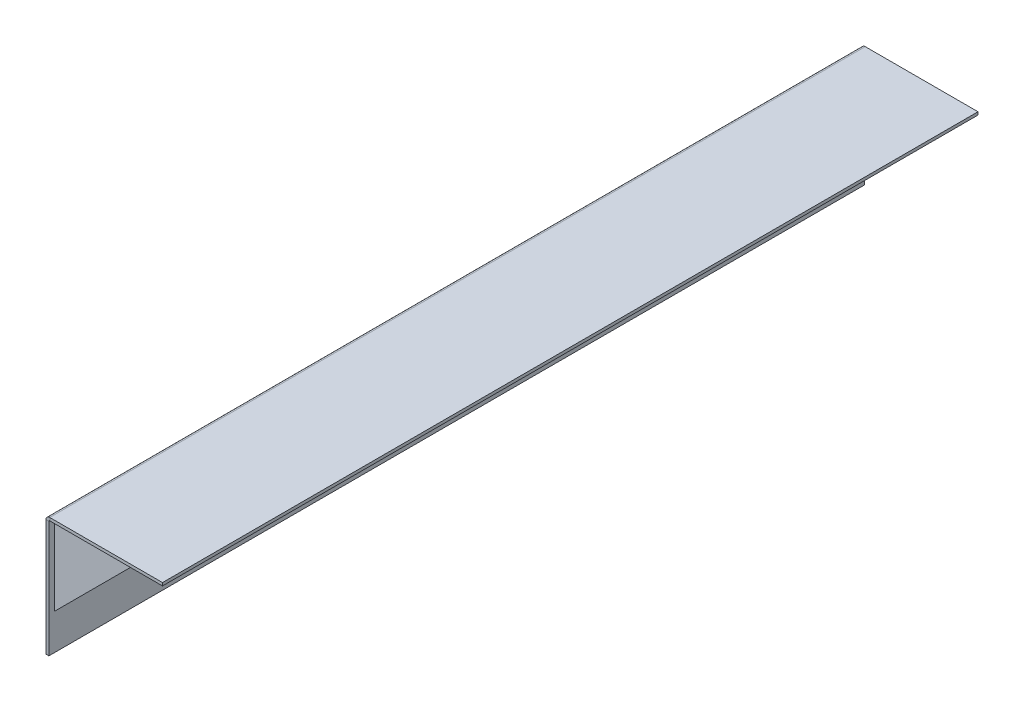
ISO-10303-21;
HEADER;
FILE_DESCRIPTION(('STEP AP214'),'2;1');
FILE_NAME('part.step','',(''),(''),'','','');
FILE_SCHEMA(('AUTOMOTIVE_DESIGN { 1 0 10303 214 1 1 1 1 }'));
ENDSEC;
DATA;
#1=APPLICATION_CONTEXT('core data for automotive mechanical design processes');
#2=APPLICATION_PROTOCOL_DEFINITION('international standard','automotive_design',2000,#1);
#3=PRODUCT_CONTEXT('',#1,'mechanical');
#4=PRODUCT('Part','Part','',(#3));
#5=PRODUCT_RELATED_PRODUCT_CATEGORY('part','',(#4));
#6=PRODUCT_DEFINITION_FORMATION('','',#4);
#7=PRODUCT_DEFINITION_CONTEXT('part definition',#1,'design');
#8=PRODUCT_DEFINITION('design','',#6,#7);
#9=PRODUCT_DEFINITION_SHAPE('','',#8);
#10=(LENGTH_UNIT() NAMED_UNIT(*) SI_UNIT(.MILLI.,.METRE.));
#11=(NAMED_UNIT(*) PLANE_ANGLE_UNIT() SI_UNIT($,.RADIAN.));
#12=(NAMED_UNIT(*) SI_UNIT($,.STERADIAN.) SOLID_ANGLE_UNIT());
#13=UNCERTAINTY_MEASURE_WITH_UNIT(LENGTH_MEASURE(1.E-05),#10,'distance_accuracy_value','');
#14=(GEOMETRIC_REPRESENTATION_CONTEXT(3) GLOBAL_UNCERTAINTY_ASSIGNED_CONTEXT((#13)) GLOBAL_UNIT_ASSIGNED_CONTEXT((#10,
#11,#12)) REPRESENTATION_CONTEXT('',''));
#15=CARTESIAN_POINT('',(0.,0.,0.));
#16=DIRECTION('',(0.,0.,1.));
#17=DIRECTION('',(1.,0.,0.));
#18=AXIS2_PLACEMENT_3D('',#15,#16,#17);
#19=CARTESIAN_POINT('',(0.,-19.2634,10.0000000000001));
#20=DIRECTION('',(-0.707106781186549,0.707106781186546,0.));
#21=DIRECTION('',(-0.707106781186546,-0.707106781186549,0.));
#22=AXIS2_PLACEMENT_3D('',#19,#20,#21);
#23=PLANE('',#22);
#24=DIRECTION('',(0.707106781186546,0.707106781186549,0.));
#25=VECTOR('',#24,1.);
#26=CARTESIAN_POINT('',(0.,-19.2634,5.00000000000006));
#27=LINE('',#26,#25);
#28=CARTESIAN_POINT('',(0.,-19.2634,5.00000000000006));
#29=VERTEX_POINT('',#28);
#30=CARTESIAN_POINT('',(70.,50.7366000000002,5.00000000000006));
#31=VERTEX_POINT('',#30);
#32=EDGE_CURVE('E124',#29,#31,#27,.T.);
#33=ORIENTED_EDGE('',*,*,#32,.T.);
#34=DIRECTION('',(0.,0.,-1.));
#35=VECTOR('',#34,1.);
#36=CARTESIAN_POINT('',(70.,50.7366000000002,10.0000000000001));
#37=LINE('',#36,#35);
#38=CARTESIAN_POINT('',(70.,50.7366000000002,10.0000000000001));
#39=VERTEX_POINT('',#38);
#40=EDGE_CURVE('E14',#39,#31,#37,.T.);
#41=ORIENTED_EDGE('',*,*,#40,.F.);
#42=DIRECTION('',(0.707106781186546,0.707106781186549,0.));
#43=VECTOR('',#42,1.);
#44=CARTESIAN_POINT('',(0.,-19.2634,10.0000000000001));
#45=LINE('',#44,#43);
#46=CARTESIAN_POINT('',(0.,-19.2634,10.0000000000001));
#47=VERTEX_POINT('',#46);
#48=EDGE_CURVE('E117',#47,#39,#45,.T.);
#49=ORIENTED_EDGE('',*,*,#48,.F.);
#50=DIRECTION('',(0.,0.,-1.));
#51=VECTOR('',#50,1.);
#52=CARTESIAN_POINT('',(0.,-19.2634,10.0000000000001));
#53=LINE('',#52,#51);
#54=EDGE_CURVE('E125',#47,#29,#53,.T.);
#55=ORIENTED_EDGE('',*,*,#54,.T.);
#56=EDGE_LOOP('',(#33,#41,#49,#55));
#57=FACE_BOUND('',#56,.T.);
#58=ADVANCED_FACE('F77',(#57),#23,.F.);
#59=CARTESIAN_POINT('',(0.,50.7366,10.0000000000001));
#60=DIRECTION('',(0.,-1.,0.));
#61=DIRECTION('',(1.,0.,0.));
#62=AXIS2_PLACEMENT_3D('',#59,#60,#61);
#63=PLANE('',#62);
#64=DIRECTION('',(-1.,0.,0.));
#65=VECTOR('',#64,1.);
#66=CARTESIAN_POINT('',(0.,50.7366,5.00000000000006));
#67=LINE('',#66,#65);
#68=CARTESIAN_POINT('',(0.,50.7366,5.00000000000006));
#69=VERTEX_POINT('',#68);
#70=EDGE_CURVE('E105',#31,#69,#67,.T.);
#71=ORIENTED_EDGE('',*,*,#70,.T.);
#72=DIRECTION('',(0.,0.,-1.));
#73=VECTOR('',#72,1.);
#74=CARTESIAN_POINT('',(0.,50.7366,10.0000000000001));
#75=LINE('',#74,#73);
#76=CARTESIAN_POINT('',(0.,50.7366,10.0000000000001));
#77=VERTEX_POINT('',#76);
#78=EDGE_CURVE('E85',#77,#69,#75,.T.);
#79=ORIENTED_EDGE('',*,*,#78,.F.);
#80=DIRECTION('',(-1.,0.,0.));
#81=VECTOR('',#80,1.);
#82=CARTESIAN_POINT('',(0.,50.7366,10.0000000000001));
#83=LINE('',#82,#81);
#84=EDGE_CURVE('E113',#39,#77,#83,.T.);
#85=ORIENTED_EDGE('',*,*,#84,.F.);
#86=ORIENTED_EDGE('',*,*,#40,.T.);
#87=EDGE_LOOP('',(#71,#79,#85,#86));
#88=FACE_BOUND('',#87,.T.);
#89=ADVANCED_FACE('F114',(#88),#63,.F.);
#90=CARTESIAN_POINT('',(0.,50.7366,10.0000000000001));
#91=DIRECTION('',(1.,0.,0.));
#92=DIRECTION('',(0.,0.,-1.));
#93=AXIS2_PLACEMENT_3D('',#90,#91,#92);
#94=PLANE('',#93);
#95=DIRECTION('',(0.,-1.,0.));
#96=VECTOR('',#95,1.);
#97=CARTESIAN_POINT('',(0.,50.7366,5.00000000000006));
#98=LINE('',#97,#96);
#99=EDGE_CURVE('E110',#69,#29,#98,.T.);
#100=ORIENTED_EDGE('',*,*,#99,.T.);
#101=ORIENTED_EDGE('',*,*,#54,.F.);
#102=DIRECTION('',(0.,-1.,0.));
#103=VECTOR('',#102,1.);
#104=CARTESIAN_POINT('',(0.,50.7366,10.0000000000001));
#105=LINE('',#104,#103);
#106=EDGE_CURVE('E93',#77,#47,#105,.T.);
#107=ORIENTED_EDGE('',*,*,#106,.F.);
#108=ORIENTED_EDGE('',*,*,#78,.T.);
#109=EDGE_LOOP('',(#100,#101,#107,#108));
#110=FACE_BOUND('',#109,.T.);
#111=ADVANCED_FACE('F132',(#110),#94,.F.);
#112=CARTESIAN_POINT('',(0.,0.,10.0000000000001));
#113=DIRECTION('',(0.,0.,-1.));
#114=DIRECTION('',(-1.,0.,0.));
#115=AXIS2_PLACEMENT_3D('',#112,#113,#114);
#116=PLANE('',#115);
#117=ORIENTED_EDGE('',*,*,#48,.T.);
#118=ORIENTED_EDGE('',*,*,#84,.T.);
#119=ORIENTED_EDGE('',*,*,#106,.T.);
#120=EDGE_LOOP('',(#117,#118,#119));
#121=FACE_BOUND('',#120,.T.);
#122=ADVANCED_FACE('F120',(#121),#116,.F.);
#123=CARTESIAN_POINT('',(0.,0.,5.00000000000006));
#124=DIRECTION('',(0.,0.,-1.));
#125=DIRECTION('',(-1.,0.,0.));
#126=AXIS2_PLACEMENT_3D('',#123,#124,#125);
#127=PLANE('',#126);
#128=ORIENTED_EDGE('',*,*,#32,.F.);
#129=ORIENTED_EDGE('',*,*,#99,.F.);
#130=ORIENTED_EDGE('',*,*,#70,.F.);
#131=EDGE_LOOP('',(#128,#129,#130));
#132=FACE_BOUND('',#131,.T.);
#133=ADVANCED_FACE('F133',(#132),#127,.T.);
#134=CLOSED_SHELL('',(#58,#89,#111,#122,#133));
#135=MANIFOLD_SOLID_BREP('B2',#134);
#136=CARTESIAN_POINT('',(0.,-19.2634,-340.));
#137=DIRECTION('',(-0.707106781186549,0.707106781186546,0.));
#138=DIRECTION('',(-0.707106781186546,-0.707106781186549,0.));
#139=AXIS2_PLACEMENT_3D('',#136,#137,#138);
#140=PLANE('',#139);
#141=DIRECTION('',(0.707106781186546,0.707106781186549,0.));
#142=VECTOR('',#141,1.);
#143=CARTESIAN_POINT('',(0.,-19.2634,-345.));
#144=LINE('',#143,#142);
#145=CARTESIAN_POINT('',(0.,-19.2634,-345.));
#146=VERTEX_POINT('',#145);
#147=CARTESIAN_POINT('',(70.,50.7366000000002,-345.));
#148=VERTEX_POINT('',#147);
#149=EDGE_CURVE('E231',#146,#148,#144,.T.);
#150=ORIENTED_EDGE('',*,*,#149,.T.);
#151=DIRECTION('',(0.,0.,-1.));
#152=VECTOR('',#151,1.);
#153=CARTESIAN_POINT('',(70.,50.7366000000002,-340.));
#154=LINE('',#153,#152);
#155=CARTESIAN_POINT('',(70.,50.7366000000002,-340.));
#156=VERTEX_POINT('',#155);
#157=EDGE_CURVE('E75',#156,#148,#154,.T.);
#158=ORIENTED_EDGE('',*,*,#157,.F.);
#159=DIRECTION('',(0.707106781186546,0.707106781186549,0.));
#160=VECTOR('',#159,1.);
#161=CARTESIAN_POINT('',(0.,-19.2634,-340.));
#162=LINE('',#161,#160);
#163=CARTESIAN_POINT('',(0.,-19.2634,-340.));
#164=VERTEX_POINT('',#163);
#165=EDGE_CURVE('E224',#164,#156,#162,.T.);
#166=ORIENTED_EDGE('',*,*,#165,.F.);
#167=DIRECTION('',(0.,0.,-1.));
#168=VECTOR('',#167,1.);
#169=CARTESIAN_POINT('',(0.,-19.2634,-340.));
#170=LINE('',#169,#168);
#171=EDGE_CURVE('E232',#164,#146,#170,.T.);
#172=ORIENTED_EDGE('',*,*,#171,.T.);
#173=EDGE_LOOP('',(#150,#158,#166,#172));
#174=FACE_BOUND('',#173,.T.);
#175=ADVANCED_FACE('F184',(#174),#140,.F.);
#176=CARTESIAN_POINT('',(0.,50.7366,-340.));
#177=DIRECTION('',(0.,-1.,0.));
#178=DIRECTION('',(1.,0.,0.));
#179=AXIS2_PLACEMENT_3D('',#176,#177,#178);
#180=PLANE('',#179);
#181=DIRECTION('',(-1.,0.,0.));
#182=VECTOR('',#181,1.);
#183=CARTESIAN_POINT('',(0.,50.7366,-345.));
#184=LINE('',#183,#182);
#185=CARTESIAN_POINT('',(0.,50.7366,-345.));
#186=VERTEX_POINT('',#185);
#187=EDGE_CURVE('E212',#148,#186,#184,.T.);
#188=ORIENTED_EDGE('',*,*,#187,.T.);
#189=DIRECTION('',(0.,0.,-1.));
#190=VECTOR('',#189,1.);
#191=CARTESIAN_POINT('',(0.,50.7366,-340.));
#192=LINE('',#191,#190);
#193=CARTESIAN_POINT('',(0.,50.7366,-340.));
#194=VERTEX_POINT('',#193);
#195=EDGE_CURVE('E192',#194,#186,#192,.T.);
#196=ORIENTED_EDGE('',*,*,#195,.F.);
#197=DIRECTION('',(-1.,0.,0.));
#198=VECTOR('',#197,1.);
#199=CARTESIAN_POINT('',(0.,50.7366,-340.));
#200=LINE('',#199,#198);
#201=EDGE_CURVE('E220',#156,#194,#200,.T.);
#202=ORIENTED_EDGE('',*,*,#201,.F.);
#203=ORIENTED_EDGE('',*,*,#157,.T.);
#204=EDGE_LOOP('',(#188,#196,#202,#203));
#205=FACE_BOUND('',#204,.T.);
#206=ADVANCED_FACE('F221',(#205),#180,.F.);
#207=CARTESIAN_POINT('',(0.,50.7366,-340.));
#208=DIRECTION('',(1.,0.,0.));
#209=DIRECTION('',(0.,0.,-1.));
#210=AXIS2_PLACEMENT_3D('',#207,#208,#209);
#211=PLANE('',#210);
#212=DIRECTION('',(0.,-1.,0.));
#213=VECTOR('',#212,1.);
#214=CARTESIAN_POINT('',(0.,50.7366,-345.));
#215=LINE('',#214,#213);
#216=EDGE_CURVE('E217',#186,#146,#215,.T.);
#217=ORIENTED_EDGE('',*,*,#216,.T.);
#218=ORIENTED_EDGE('',*,*,#171,.F.);
#219=DIRECTION('',(0.,-1.,0.));
#220=VECTOR('',#219,1.);
#221=CARTESIAN_POINT('',(0.,50.7366,-340.));
#222=LINE('',#221,#220);
#223=EDGE_CURVE('E200',#194,#164,#222,.T.);
#224=ORIENTED_EDGE('',*,*,#223,.F.);
#225=ORIENTED_EDGE('',*,*,#195,.T.);
#226=EDGE_LOOP('',(#217,#218,#224,#225));
#227=FACE_BOUND('',#226,.T.);
#228=ADVANCED_FACE('F239',(#227),#211,.F.);
#229=CARTESIAN_POINT('',(0.,0.,-340.));
#230=DIRECTION('',(0.,0.,-1.));
#231=DIRECTION('',(-1.,0.,0.));
#232=AXIS2_PLACEMENT_3D('',#229,#230,#231);
#233=PLANE('',#232);
#234=ORIENTED_EDGE('',*,*,#165,.T.);
#235=ORIENTED_EDGE('',*,*,#201,.T.);
#236=ORIENTED_EDGE('',*,*,#223,.T.);
#237=EDGE_LOOP('',(#234,#235,#236));
#238=FACE_BOUND('',#237,.T.);
#239=ADVANCED_FACE('F227',(#238),#233,.F.);
#240=CARTESIAN_POINT('',(0.,0.,-345.));
#241=DIRECTION('',(0.,0.,-1.));
#242=DIRECTION('',(-1.,0.,0.));
#243=AXIS2_PLACEMENT_3D('',#240,#241,#242);
#244=PLANE('',#243);
#245=ORIENTED_EDGE('',*,*,#149,.F.);
#246=ORIENTED_EDGE('',*,*,#216,.F.);
#247=ORIENTED_EDGE('',*,*,#187,.F.);
#248=EDGE_LOOP('',(#245,#246,#247));
#249=FACE_BOUND('',#248,.T.);
#250=ADVANCED_FACE('F240',(#249),#244,.T.);
#251=CLOSED_SHELL('',(#175,#206,#228,#239,#250));
#252=MANIFOLD_SOLID_BREP('B8',#251);
#253=CARTESIAN_POINT('',(0.,-19.2634,340.));
#254=DIRECTION('',(-0.707106781186549,0.707106781186546,0.));
#255=DIRECTION('',(-0.707106781186546,-0.707106781186549,0.));
#256=AXIS2_PLACEMENT_3D('',#253,#254,#255);
#257=PLANE('',#256);
#258=DIRECTION('',(-0.707106781186546,-0.707106781186549,0.));
#259=VECTOR('',#258,1.);
#260=CARTESIAN_POINT('',(0.,-19.2634,345.));
#261=LINE('',#260,#259);
#262=CARTESIAN_POINT('',(70.,50.7366000000002,345.));
#263=VERTEX_POINT('',#262);
#264=CARTESIAN_POINT('',(0.,-19.2634,345.));
#265=VERTEX_POINT('',#264);
#266=EDGE_CURVE('E337',#263,#265,#261,.T.);
#267=ORIENTED_EDGE('',*,*,#266,.T.);
#268=DIRECTION('',(0.,0.,1.));
#269=VECTOR('',#268,1.);
#270=CARTESIAN_POINT('',(0.,-19.2634,340.));
#271=LINE('',#270,#269);
#272=CARTESIAN_POINT('',(0.,-19.2634,340.));
#273=VERTEX_POINT('',#272);
#274=EDGE_CURVE('E182',#273,#265,#271,.T.);
#275=ORIENTED_EDGE('',*,*,#274,.F.);
#276=DIRECTION('',(-0.707106781186546,-0.707106781186549,0.));
#277=VECTOR('',#276,1.);
#278=CARTESIAN_POINT('',(0.,-19.2634,340.));
#279=LINE('',#278,#277);
#280=CARTESIAN_POINT('',(70.,50.7366000000002,340.));
#281=VERTEX_POINT('',#280);
#282=EDGE_CURVE('E330',#281,#273,#279,.T.);
#283=ORIENTED_EDGE('',*,*,#282,.F.);
#284=DIRECTION('',(0.,0.,1.));
#285=VECTOR('',#284,1.);
#286=CARTESIAN_POINT('',(70.,50.7366000000002,340.));
#287=LINE('',#286,#285);
#288=EDGE_CURVE('E338',#281,#263,#287,.T.);
#289=ORIENTED_EDGE('',*,*,#288,.T.);
#290=EDGE_LOOP('',(#267,#275,#283,#289));
#291=FACE_BOUND('',#290,.T.);
#292=ADVANCED_FACE('F290',(#291),#257,.F.);
#293=CARTESIAN_POINT('',(0.,50.7366,340.));
#294=DIRECTION('',(1.,0.,0.));
#295=DIRECTION('',(0.,0.,-1.));
#296=AXIS2_PLACEMENT_3D('',#293,#294,#295);
#297=PLANE('',#296);
#298=DIRECTION('',(0.,1.,0.));
#299=VECTOR('',#298,1.);
#300=CARTESIAN_POINT('',(0.,50.7366,345.));
#301=LINE('',#300,#299);
#302=CARTESIAN_POINT('',(0.,50.7366,345.));
#303=VERTEX_POINT('',#302);
#304=EDGE_CURVE('E318',#265,#303,#301,.T.);
#305=ORIENTED_EDGE('',*,*,#304,.T.);
#306=DIRECTION('',(0.,0.,1.));
#307=VECTOR('',#306,1.);
#308=CARTESIAN_POINT('',(0.,50.7366,340.));
#309=LINE('',#308,#307);
#310=CARTESIAN_POINT('',(0.,50.7366,340.));
#311=VERTEX_POINT('',#310);
#312=EDGE_CURVE('E298',#311,#303,#309,.T.);
#313=ORIENTED_EDGE('',*,*,#312,.F.);
#314=DIRECTION('',(0.,1.,0.));
#315=VECTOR('',#314,1.);
#316=CARTESIAN_POINT('',(0.,50.7366,340.));
#317=LINE('',#316,#315);
#318=EDGE_CURVE('E326',#273,#311,#317,.T.);
#319=ORIENTED_EDGE('',*,*,#318,.F.);
#320=ORIENTED_EDGE('',*,*,#274,.T.);
#321=EDGE_LOOP('',(#305,#313,#319,#320));
#322=FACE_BOUND('',#321,.T.);
#323=ADVANCED_FACE('F327',(#322),#297,.F.);
#324=CARTESIAN_POINT('',(0.,50.7366,340.));
#325=DIRECTION('',(0.,-1.,0.));
#326=DIRECTION('',(1.,0.,0.));
#327=AXIS2_PLACEMENT_3D('',#324,#325,#326);
#328=PLANE('',#327);
#329=DIRECTION('',(1.,0.,0.));
#330=VECTOR('',#329,1.);
#331=CARTESIAN_POINT('',(0.,50.7366,345.));
#332=LINE('',#331,#330);
#333=EDGE_CURVE('E323',#303,#263,#332,.T.);
#334=ORIENTED_EDGE('',*,*,#333,.T.);
#335=ORIENTED_EDGE('',*,*,#288,.F.);
#336=DIRECTION('',(1.,0.,0.));
#337=VECTOR('',#336,1.);
#338=CARTESIAN_POINT('',(0.,50.7366,340.));
#339=LINE('',#338,#337);
#340=EDGE_CURVE('E306',#311,#281,#339,.T.);
#341=ORIENTED_EDGE('',*,*,#340,.F.);
#342=ORIENTED_EDGE('',*,*,#312,.T.);
#343=EDGE_LOOP('',(#334,#335,#341,#342));
#344=FACE_BOUND('',#343,.T.);
#345=ADVANCED_FACE('F345',(#344),#328,.F.);
#346=CARTESIAN_POINT('',(0.,0.,340.));
#347=DIRECTION('',(0.,0.,-1.));
#348=DIRECTION('',(-1.,0.,0.));
#349=AXIS2_PLACEMENT_3D('',#346,#347,#348);
#350=PLANE('',#349);
#351=ORIENTED_EDGE('',*,*,#282,.T.);
#352=ORIENTED_EDGE('',*,*,#318,.T.);
#353=ORIENTED_EDGE('',*,*,#340,.T.);
#354=EDGE_LOOP('',(#351,#352,#353));
#355=FACE_BOUND('',#354,.T.);
#356=ADVANCED_FACE('F333',(#355),#350,.T.);
#357=CARTESIAN_POINT('',(0.,0.,345.));
#358=DIRECTION('',(0.,0.,-1.));
#359=DIRECTION('',(-1.,0.,0.));
#360=AXIS2_PLACEMENT_3D('',#357,#358,#359);
#361=PLANE('',#360);
#362=ORIENTED_EDGE('',*,*,#266,.F.);
#363=ORIENTED_EDGE('',*,*,#333,.F.);
#364=ORIENTED_EDGE('',*,*,#304,.F.);
#365=EDGE_LOOP('',(#362,#363,#364));
#366=FACE_BOUND('',#365,.T.);
#367=ADVANCED_FACE('F346',(#366),#361,.F.);
#368=CLOSED_SHELL('',(#292,#323,#345,#356,#367));
#369=MANIFOLD_SOLID_BREP('B69',#368);
#370=CARTESIAN_POINT('',(-2.5,-50.,-350.));
#371=DIRECTION('',(0.,0.,-1.));
#372=DIRECTION('',(-1.,0.,0.));
#373=AXIS2_PLACEMENT_3D('',#370,#371,#372);
#374=PLANE('',#373);
#375=DIRECTION('',(0.,1.,0.));
#376=VECTOR('',#375,1.);
#377=CARTESIAN_POINT('',(0.,-50.,-350.));
#378=LINE('',#377,#376);
#379=CARTESIAN_POINT('',(0.,-50.,-350.));
#380=VERTEX_POINT('',#379);
#381=CARTESIAN_POINT('',(0.,50.,-350.));
#382=VERTEX_POINT('',#381);
#383=EDGE_CURVE('E501',#380,#382,#378,.T.);
#384=ORIENTED_EDGE('',*,*,#383,.F.);
#385=DIRECTION('',(1.,0.,0.));
#386=VECTOR('',#385,1.);
#387=CARTESIAN_POINT('',(-2.5,-50.,-350.));
#388=LINE('',#387,#386);
#389=CARTESIAN_POINT('',(-2.5,-50.,-350.));
#390=VERTEX_POINT('',#389);
#391=EDGE_CURVE('E288',#390,#380,#388,.T.);
#392=ORIENTED_EDGE('',*,*,#391,.F.);
#393=DIRECTION('',(0.,1.,0.));
#394=VECTOR('',#393,1.);
#395=CARTESIAN_POINT('',(-2.5,-50.,-350.));
#396=LINE('',#395,#394);
#397=CARTESIAN_POINT('',(-2.5,50.,-350.));
#398=VERTEX_POINT('',#397);
#399=EDGE_CURVE('E511',#390,#398,#396,.T.);
#400=ORIENTED_EDGE('',*,*,#399,.T.);
#401=DIRECTION('',(1.,0.,0.));
#402=VECTOR('',#401,1.);
#403=CARTESIAN_POINT('',(-2.5,50.,-350.));
#404=LINE('',#403,#402);
#405=EDGE_CURVE('E390',#398,#382,#404,.T.);
#406=ORIENTED_EDGE('',*,*,#405,.T.);
#407=EDGE_LOOP('',(#384,#392,#400,#406));
#408=FACE_BOUND('',#407,.T.);
#409=ADVANCED_FACE('F387',(#408),#374,.T.);
#410=CARTESIAN_POINT('',(-2.5,-50.,350.));
#411=DIRECTION('',(0.,-1.,0.));
#412=DIRECTION('',(0.,0.,-1.));
#413=AXIS2_PLACEMENT_3D('',#410,#411,#412);
#414=PLANE('',#413);
#415=DIRECTION('',(0.,0.,-1.));
#416=VECTOR('',#415,1.);
#417=CARTESIAN_POINT('',(0.,-50.,350.));
#418=LINE('',#417,#416);
#419=CARTESIAN_POINT('',(0.,-50.,350.));
#420=VERTEX_POINT('',#419);
#421=EDGE_CURVE('E513',#420,#380,#418,.T.);
#422=ORIENTED_EDGE('',*,*,#421,.F.);
#423=DIRECTION('',(1.,0.,0.));
#424=VECTOR('',#423,1.);
#425=CARTESIAN_POINT('',(-2.5,-50.,350.));
#426=LINE('',#425,#424);
#427=CARTESIAN_POINT('',(-2.5,-50.,350.));
#428=VERTEX_POINT('',#427);
#429=EDGE_CURVE('E396',#428,#420,#426,.T.);
#430=ORIENTED_EDGE('',*,*,#429,.F.);
#431=DIRECTION('',(0.,0.,-1.));
#432=VECTOR('',#431,1.);
#433=CARTESIAN_POINT('',(-2.5,-50.,350.));
#434=LINE('',#433,#432);
#435=EDGE_CURVE('E517',#428,#390,#434,.T.);
#436=ORIENTED_EDGE('',*,*,#435,.T.);
#437=ORIENTED_EDGE('',*,*,#391,.T.);
#438=EDGE_LOOP('',(#422,#430,#436,#437));
#439=FACE_BOUND('',#438,.T.);
#440=ADVANCED_FACE('F564',(#439),#414,.T.);
#441=CARTESIAN_POINT('',(-2.5,-50.,350.));
#442=DIRECTION('',(0.,0.,1.));
#443=DIRECTION('',(1.,0.,0.));
#444=AXIS2_PLACEMENT_3D('',#441,#442,#443);
#445=PLANE('',#444);
#446=DIRECTION('',(0.,-1.,0.));
#447=VECTOR('',#446,1.);
#448=CARTESIAN_POINT('',(0.,-50.,350.));
#449=LINE('',#448,#447);
#450=CARTESIAN_POINT('',(0.,50.,350.));
#451=VERTEX_POINT('',#450);
#452=EDGE_CURVE('E524',#451,#420,#449,.T.);
#453=ORIENTED_EDGE('',*,*,#452,.F.);
#454=DIRECTION('',(1.,0.,0.));
#455=VECTOR('',#454,1.);
#456=CARTESIAN_POINT('',(-2.5,50.,350.));
#457=LINE('',#456,#455);
#458=CARTESIAN_POINT('',(-2.50000000000003,50.,350.));
#459=VERTEX_POINT('',#458);
#460=EDGE_CURVE('E528',#459,#451,#457,.T.);
#461=ORIENTED_EDGE('',*,*,#460,.F.);
#462=DIRECTION('',(0.,-1.,0.));
#463=VECTOR('',#462,1.);
#464=CARTESIAN_POINT('',(-2.5,-50.,350.));
#465=LINE('',#464,#463);
#466=EDGE_CURVE('E515',#459,#428,#465,.T.);
#467=ORIENTED_EDGE('',*,*,#466,.T.);
#468=ORIENTED_EDGE('',*,*,#429,.T.);
#469=EDGE_LOOP('',(#453,#461,#467,#468));
#470=FACE_BOUND('',#469,.T.);
#471=ADVANCED_FACE('F568',(#470),#445,.T.);
#472=CARTESIAN_POINT('',(-2.5,0.,0.));
#473=DIRECTION('',(-1.,0.,0.));
#474=DIRECTION('',(0.,0.,1.));
#475=AXIS2_PLACEMENT_3D('',#472,#473,#474);
#476=PLANE('',#475);
#477=ORIENTED_EDGE('',*,*,#399,.F.);
#478=ORIENTED_EDGE('',*,*,#435,.F.);
#479=ORIENTED_EDGE('',*,*,#466,.F.);
#480=DIRECTION('',(0.,0.,1.));
#481=VECTOR('',#480,1.);
#482=CARTESIAN_POINT('',(-2.5,50.,350.));
#483=LINE('',#482,#481);
#484=EDGE_CURVE('E428',#398,#459,#483,.T.);
#485=ORIENTED_EDGE('',*,*,#484,.F.);
#486=EDGE_LOOP('',(#477,#478,#479,#485));
#487=FACE_BOUND('',#486,.T.);
#488=ADVANCED_FACE('F573',(#487),#476,.T.);
#489=CARTESIAN_POINT('',(0.,0.,0.));
#490=DIRECTION('',(-1.,0.,0.));
#491=DIRECTION('',(0.,0.,1.));
#492=AXIS2_PLACEMENT_3D('',#489,#490,#491);
#493=PLANE('',#492);
#494=ORIENTED_EDGE('',*,*,#383,.T.);
#495=DIRECTION('',(0.,0.,1.));
#496=VECTOR('',#495,1.);
#497=CARTESIAN_POINT('',(0.,50.,350.));
#498=LINE('',#497,#496);
#499=EDGE_CURVE('E521',#382,#451,#498,.T.);
#500=ORIENTED_EDGE('',*,*,#499,.T.);
#501=ORIENTED_EDGE('',*,*,#452,.T.);
#502=ORIENTED_EDGE('',*,*,#421,.T.);
#503=EDGE_LOOP('',(#494,#500,#501,#502));
#504=FACE_BOUND('',#503,.T.);
#505=ADVANCED_FACE('F539',(#504),#493,.F.);
#506=CARTESIAN_POINT('',(0.736600000000015,50.,-350.));
#507=DIRECTION('',(0.,0.,-1.));
#508=DIRECTION('',(-1.,0.,0.));
#509=AXIS2_PLACEMENT_3D('',#506,#507,#508);
#510=PLANE('',#509);
#511=DIRECTION('',(0.,-1.,0.));
#512=VECTOR('',#511,1.);
#513=CARTESIAN_POINT('',(0.736599999999988,53.2366,-350.));
#514=LINE('',#513,#512);
#515=CARTESIAN_POINT('',(0.736600000000012,50.7366,-350.));
#516=VERTEX_POINT('',#515);
#517=CARTESIAN_POINT('',(0.736600000000003,53.2366,-349.999999999999));
#518=VERTEX_POINT('',#517);
#519=EDGE_CURVE('E481',#516,#518,#514,.F.);
#520=ORIENTED_EDGE('',*,*,#519,.F.);
#521=CARTESIAN_POINT('',(0.736600000000015,50.,-350.));
#522=DIRECTION('',(0.,0.,1.));
#523=DIRECTION('',(1.,0.,0.));
#524=AXIS2_PLACEMENT_3D('',#521,#522,#523);
#525=CIRCLE('',#524,0.736599999999997);
#526=EDGE_CURVE('E505',#382,#516,#525,.F.);
#527=ORIENTED_EDGE('',*,*,#526,.F.);
#528=ORIENTED_EDGE('',*,*,#405,.F.);
#529=CARTESIAN_POINT('',(0.736600000000015,50.,-349.999999999999));
#530=DIRECTION('',(0.,0.,1.));
#531=DIRECTION('',(1.,0.,0.));
#532=AXIS2_PLACEMENT_3D('',#529,#530,#531);
#533=CIRCLE('',#532,3.2366);
#534=EDGE_CURVE('E498',#398,#518,#533,.F.);
#535=ORIENTED_EDGE('',*,*,#534,.T.);
#536=EDGE_LOOP('',(#520,#527,#528,#535));
#537=FACE_BOUND('',#536,.T.);
#538=ADVANCED_FACE('F543',(#537),#510,.T.);
#539=CARTESIAN_POINT('',(0.736599999999963,50.,350.));
#540=DIRECTION('',(0.,0.,-1.));
#541=DIRECTION('',(-1.,0.,0.));
#542=AXIS2_PLACEMENT_3D('',#539,#540,#541);
#543=PLANE('',#542);
#544=CARTESIAN_POINT('',(0.736599999999963,50.,350.));
#545=DIRECTION('',(0.,0.,1.));
#546=DIRECTION('',(1.,0.,0.));
#547=AXIS2_PLACEMENT_3D('',#544,#545,#546);
#548=CIRCLE('',#547,0.736599999999997);
#549=CARTESIAN_POINT('',(0.736599999999961,50.7366,350.));
#550=VERTEX_POINT('',#549);
#551=EDGE_CURVE('E508',#550,#451,#548,.T.);
#552=ORIENTED_EDGE('',*,*,#551,.F.);
#553=DIRECTION('',(0.,-1.,0.));
#554=VECTOR('',#553,1.);
#555=CARTESIAN_POINT('',(0.736599999999976,50.7366,350.));
#556=LINE('',#555,#554);
#557=CARTESIAN_POINT('',(0.736599999999968,53.2366,350.));
#558=VERTEX_POINT('',#557);
#559=EDGE_CURVE('E492',#550,#558,#556,.F.);
#560=ORIENTED_EDGE('',*,*,#559,.T.);
#561=CARTESIAN_POINT('',(0.736599999999963,50.,350.));
#562=DIRECTION('',(0.,0.,1.));
#563=DIRECTION('',(1.,0.,0.));
#564=AXIS2_PLACEMENT_3D('',#561,#562,#563);
#565=CIRCLE('',#564,3.2366);
#566=EDGE_CURVE('E502',#558,#459,#565,.T.);
#567=ORIENTED_EDGE('',*,*,#566,.T.);
#568=ORIENTED_EDGE('',*,*,#460,.T.);
#569=EDGE_LOOP('',(#552,#560,#567,#568));
#570=FACE_BOUND('',#569,.T.);
#571=ADVANCED_FACE('F553',(#570),#543,.F.);
#572=CARTESIAN_POINT('',(0.736599999999963,50.,350.));
#573=DIRECTION('',(0.,0.,1.));
#574=DIRECTION('',(0.,1.,0.));
#575=AXIS2_PLACEMENT_3D('',#572,#573,#574);
#576=CYLINDRICAL_SURFACE('',#575,3.2366);
#577=ORIENTED_EDGE('',*,*,#484,.T.);
#578=ORIENTED_EDGE('',*,*,#566,.F.);
#579=DIRECTION('',(0.,0.,1.));
#580=VECTOR('',#579,1.);
#581=CARTESIAN_POINT('',(0.736599999999988,53.2366,-350.));
#582=LINE('',#581,#580);
#583=EDGE_CURVE('E490',#558,#518,#582,.F.);
#584=ORIENTED_EDGE('',*,*,#583,.T.);
#585=ORIENTED_EDGE('',*,*,#534,.F.);
#586=EDGE_LOOP('',(#577,#578,#584,#585));
#587=FACE_BOUND('',#586,.T.);
#588=ADVANCED_FACE('F545',(#587),#576,.T.);
#589=CARTESIAN_POINT('',(0.736599999999963,50.,350.));
#590=DIRECTION('',(0.,0.,1.));
#591=DIRECTION('',(0.,1.,0.));
#592=AXIS2_PLACEMENT_3D('',#589,#590,#591);
#593=CYLINDRICAL_SURFACE('',#592,0.736599999999997);
#594=ORIENTED_EDGE('',*,*,#499,.F.);
#595=ORIENTED_EDGE('',*,*,#526,.T.);
#596=DIRECTION('',(0.,0.,1.));
#597=VECTOR('',#596,1.);
#598=CARTESIAN_POINT('',(0.736599999999997,50.7366,-350.));
#599=LINE('',#598,#597);
#600=EDGE_CURVE('E495',#516,#550,#599,.T.);
#601=ORIENTED_EDGE('',*,*,#600,.T.);
#602=ORIENTED_EDGE('',*,*,#551,.T.);
#603=EDGE_LOOP('',(#594,#595,#601,#602));
#604=FACE_BOUND('',#603,.T.);
#605=ADVANCED_FACE('F541',(#604),#593,.F.);
#606=CARTESIAN_POINT('',(0.,53.2366,-350.));
#607=DIRECTION('',(0.,0.,1.));
#608=DIRECTION('',(1.,0.,0.));
#609=AXIS2_PLACEMENT_3D('',#606,#607,#608);
#610=PLANE('',#609);
#611=ORIENTED_EDGE('',*,*,#519,.T.);
#612=DIRECTION('',(-1.,0.,0.));
#613=VECTOR('',#612,1.);
#614=CARTESIAN_POINT('',(-3.82361452019035E-13,53.2366,-350.));
#615=LINE('',#614,#613);
#616=CARTESIAN_POINT('',(97.5,53.2366000000003,-350.));
#617=VERTEX_POINT('',#616);
#618=EDGE_CURVE('E462',#617,#518,#615,.T.);
#619=ORIENTED_EDGE('',*,*,#618,.F.);
#620=DIRECTION('',(0.,-1.,0.));
#621=VECTOR('',#620,1.);
#622=CARTESIAN_POINT('',(97.5,53.2366000000003,-350.));
#623=LINE('',#622,#621);
#624=CARTESIAN_POINT('',(97.5,50.7366000000003,-350.));
#625=VERTEX_POINT('',#624);
#626=EDGE_CURVE('E468',#617,#625,#623,.T.);
#627=ORIENTED_EDGE('',*,*,#626,.T.);
#628=DIRECTION('',(1.,0.,0.));
#629=VECTOR('',#628,1.);
#630=CARTESIAN_POINT('',(0.,50.7366,-350.));
#631=LINE('',#630,#629);
#632=EDGE_CURVE('E488',#625,#516,#631,.F.);
#633=ORIENTED_EDGE('',*,*,#632,.T.);
#634=EDGE_LOOP('',(#611,#619,#627,#633));
#635=FACE_BOUND('',#634,.T.);
#636=ADVANCED_FACE('F480',(#635),#610,.F.);
#637=CARTESIAN_POINT('',(97.5,53.2366000000003,350.));
#638=DIRECTION('',(0.,0.,-1.));
#639=DIRECTION('',(-1.,0.,0.));
#640=AXIS2_PLACEMENT_3D('',#637,#638,#639);
#641=PLANE('',#640);
#642=ORIENTED_EDGE('',*,*,#559,.F.);
#643=DIRECTION('',(-1.,0.,0.));
#644=VECTOR('',#643,1.);
#645=CARTESIAN_POINT('',(97.5,50.7366000000003,350.));
#646=LINE('',#645,#644);
#647=CARTESIAN_POINT('',(97.5,50.7366000000003,350.));
#648=VERTEX_POINT('',#647);
#649=EDGE_CURVE('E484',#550,#648,#646,.F.);
#650=ORIENTED_EDGE('',*,*,#649,.T.);
#651=DIRECTION('',(0.,-1.,0.));
#652=VECTOR('',#651,1.);
#653=CARTESIAN_POINT('',(97.5,53.2366000000003,350.));
#654=LINE('',#653,#652);
#655=CARTESIAN_POINT('',(97.5,53.2366000000003,350.));
#656=VERTEX_POINT('',#655);
#657=EDGE_CURVE('E477',#656,#648,#654,.T.);
#658=ORIENTED_EDGE('',*,*,#657,.F.);
#659=DIRECTION('',(1.,0.,0.));
#660=VECTOR('',#659,1.);
#661=CARTESIAN_POINT('',(0.,53.2366,350.));
#662=LINE('',#661,#660);
#663=EDGE_CURVE('E464',#558,#656,#662,.T.);
#664=ORIENTED_EDGE('',*,*,#663,.F.);
#665=EDGE_LOOP('',(#642,#650,#658,#664));
#666=FACE_BOUND('',#665,.T.);
#667=ADVANCED_FACE('F548',(#666),#641,.F.);
#668=CARTESIAN_POINT('',(-1.83090652727341E-13,53.2366,0.));
#669=DIRECTION('',(0.,-1.,0.));
#670=DIRECTION('',(1.,0.,0.));
#671=AXIS2_PLACEMENT_3D('',#668,#669,#670);
#672=PLANE('',#671);
#673=ORIENTED_EDGE('',*,*,#583,.F.);
#674=ORIENTED_EDGE('',*,*,#663,.T.);
#675=DIRECTION('',(0.,0.,-1.));
#676=VECTOR('',#675,1.);
#677=CARTESIAN_POINT('',(97.5,53.2366000000003,0.));
#678=LINE('',#677,#676);
#679=EDGE_CURVE('E457',#656,#617,#678,.T.);
#680=ORIENTED_EDGE('',*,*,#679,.T.);
#681=ORIENTED_EDGE('',*,*,#618,.T.);
#682=EDGE_LOOP('',(#673,#674,#680,#681));
#683=FACE_BOUND('',#682,.T.);
#684=ADVANCED_FACE('F460',(#683),#672,.F.);
#685=CARTESIAN_POINT('',(-1.74361949380233E-13,50.7366,0.));
#686=DIRECTION('',(0.,-1.,0.));
#687=DIRECTION('',(1.,0.,0.));
#688=AXIS2_PLACEMENT_3D('',#685,#686,#687);
#689=PLANE('',#688);
#690=ORIENTED_EDGE('',*,*,#649,.F.);
#691=ORIENTED_EDGE('',*,*,#600,.F.);
#692=ORIENTED_EDGE('',*,*,#632,.F.);
#693=DIRECTION('',(0.,0.,1.));
#694=VECTOR('',#693,1.);
#695=CARTESIAN_POINT('',(97.5,50.7366000000003,-350.));
#696=LINE('',#695,#694);
#697=EDGE_CURVE('E473',#648,#625,#696,.F.);
#698=ORIENTED_EDGE('',*,*,#697,.F.);
#699=EDGE_LOOP('',(#690,#691,#692,#698));
#700=FACE_BOUND('',#699,.T.);
#701=ADVANCED_FACE('F552',(#700),#689,.T.);
#702=CARTESIAN_POINT('',(97.5,53.2366000000003,-350.));
#703=DIRECTION('',(-1.,0.,0.));
#704=DIRECTION('',(0.,-1.,0.));
#705=AXIS2_PLACEMENT_3D('',#702,#703,#704);
#706=PLANE('',#705);
#707=ORIENTED_EDGE('',*,*,#697,.T.);
#708=ORIENTED_EDGE('',*,*,#626,.F.);
#709=ORIENTED_EDGE('',*,*,#679,.F.);
#710=ORIENTED_EDGE('',*,*,#657,.T.);
#711=EDGE_LOOP('',(#707,#708,#709,#710));
#712=FACE_BOUND('',#711,.T.);
#713=ADVANCED_FACE('F471',(#712),#706,.F.);
#714=CLOSED_SHELL('',(#409,#440,#471,#488,#505,#538,#571,#588,#605,#636,#667,#684,#701,#713));
#715=MANIFOLD_SOLID_BREP('B176',#714);
#716=ADVANCED_BREP_SHAPE_REPRESENTATION('',(#18,#135,#252,#369,#715),#14);
#717=SHAPE_DEFINITION_REPRESENTATION(#9,#716);
ENDSEC;
END-ISO-10303-21;
